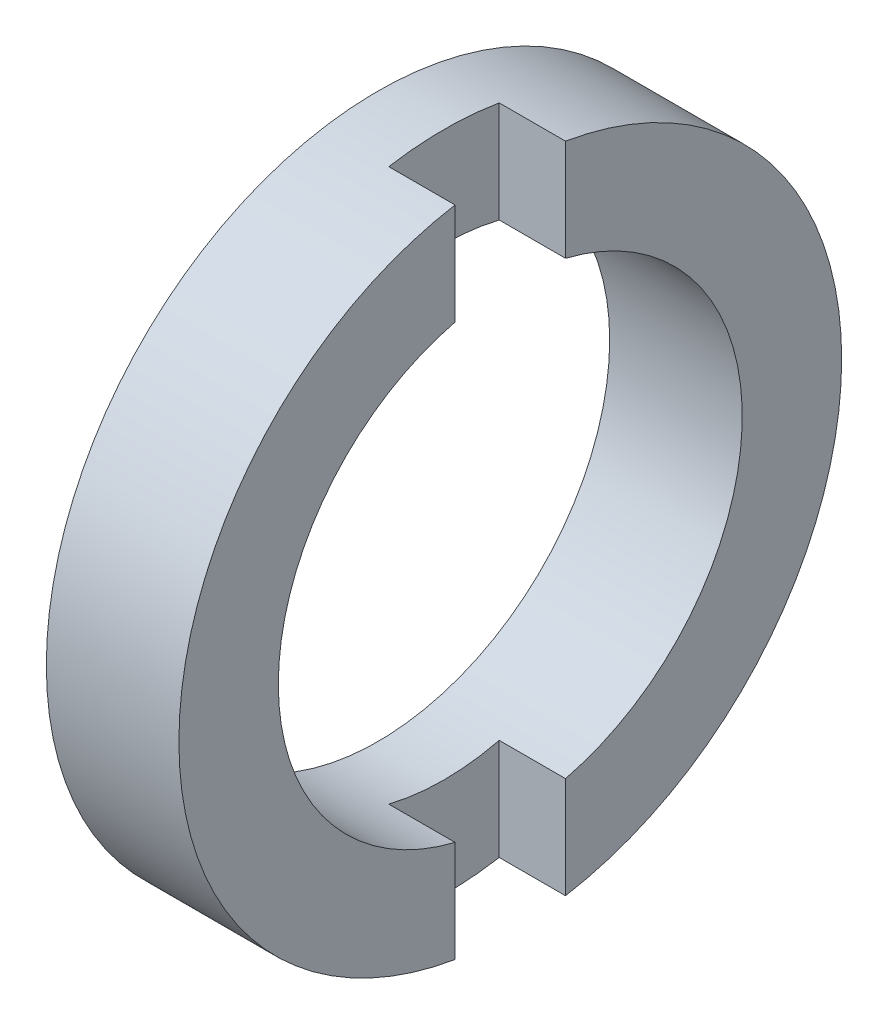
ISO-10303-21;
HEADER;
FILE_DESCRIPTION(('STEP AP214'),'2;1');
FILE_NAME('part.step','',(''),(''),'','','');
FILE_SCHEMA(('AUTOMOTIVE_DESIGN { 1 0 10303 214 1 1 1 1 }'));
ENDSEC;
DATA;
#1=APPLICATION_CONTEXT('core data for automotive mechanical design processes');
#2=APPLICATION_PROTOCOL_DEFINITION('international standard','automotive_design',2000,#1);
#3=PRODUCT_CONTEXT('',#1,'mechanical');
#4=PRODUCT('Part','Part','',(#3));
#5=PRODUCT_RELATED_PRODUCT_CATEGORY('part','',(#4));
#6=PRODUCT_DEFINITION_FORMATION('','',#4);
#7=PRODUCT_DEFINITION_CONTEXT('part definition',#1,'design');
#8=PRODUCT_DEFINITION('design','',#6,#7);
#9=PRODUCT_DEFINITION_SHAPE('','',#8);
#10=(LENGTH_UNIT() NAMED_UNIT(*) SI_UNIT(.MILLI.,.METRE.));
#11=(NAMED_UNIT(*) PLANE_ANGLE_UNIT() SI_UNIT($,.RADIAN.));
#12=(NAMED_UNIT(*) SI_UNIT($,.STERADIAN.) SOLID_ANGLE_UNIT());
#13=UNCERTAINTY_MEASURE_WITH_UNIT(LENGTH_MEASURE(1.E-05),#10,'distance_accuracy_value','');
#14=(GEOMETRIC_REPRESENTATION_CONTEXT(3) GLOBAL_UNCERTAINTY_ASSIGNED_CONTEXT((#13)) GLOBAL_UNIT_ASSIGNED_CONTEXT((#10,
#11,#12)) REPRESENTATION_CONTEXT('',''));
#15=CARTESIAN_POINT('',(0.,0.,0.));
#16=DIRECTION('',(0.,0.,1.));
#17=DIRECTION('',(1.,0.,0.));
#18=AXIS2_PLACEMENT_3D('',#15,#16,#17);
#19=CARTESIAN_POINT('',(6.,-15.,-2.5));
#20=DIRECTION('',(0.,0.,-1.));
#21=DIRECTION('',(-1.,0.,0.));
#22=AXIS2_PLACEMENT_3D('',#19,#20,#21);
#23=PLANE('',#22);
#24=DIRECTION('',(-1.,0.,0.));
#25=VECTOR('',#24,1.);
#26=CARTESIAN_POINT('',(0.,-10.1980390271856,-2.5));
#27=LINE('',#26,#25);
#28=CARTESIAN_POINT('',(6.,-10.1980390271856,-2.5));
#29=VERTEX_POINT('',#28);
#30=CARTESIAN_POINT('',(3.,-10.1980390271856,-2.5));
#31=VERTEX_POINT('',#30);
#32=EDGE_CURVE('E121',#29,#31,#27,.T.);
#33=ORIENTED_EDGE('',*,*,#32,.T.);
#34=DIRECTION('',(0.,1.,0.));
#35=VECTOR('',#34,1.);
#36=CARTESIAN_POINT('',(3.,-15.,-2.5));
#37=LINE('',#36,#35);
#38=CARTESIAN_POINT('',(3.,-14.790199457749,-2.5));
#39=VERTEX_POINT('',#38);
#40=EDGE_CURVE('E90',#31,#39,#37,.F.);
#41=ORIENTED_EDGE('',*,*,#40,.T.);
#42=DIRECTION('',(-1.,0.,0.));
#43=VECTOR('',#42,1.);
#44=CARTESIAN_POINT('',(0.,-14.790199457749,-2.5));
#45=LINE('',#44,#43);
#46=CARTESIAN_POINT('',(6.,-14.790199457749,-2.5));
#47=VERTEX_POINT('',#46);
#48=EDGE_CURVE('E153',#47,#39,#45,.T.);
#49=ORIENTED_EDGE('',*,*,#48,.F.);
#50=DIRECTION('',(0.,1.,0.));
#51=VECTOR('',#50,1.);
#52=CARTESIAN_POINT('',(6.,15.,-2.5));
#53=LINE('',#52,#51);
#54=EDGE_CURVE('E106',#47,#29,#53,.T.);
#55=ORIENTED_EDGE('',*,*,#54,.T.);
#56=EDGE_LOOP('',(#33,#41,#49,#55));
#57=FACE_BOUND('',#56,.T.);
#58=ADVANCED_FACE('F17',(#57),#23,.F.);
#59=CARTESIAN_POINT('',(3.,-15.,-2.5));
#60=DIRECTION('',(-1.,0.,0.));
#61=DIRECTION('',(0.,0.,1.));
#62=AXIS2_PLACEMENT_3D('',#59,#60,#61);
#63=PLANE('',#62);
#64=CARTESIAN_POINT('',(3.,0.,0.));
#65=DIRECTION('',(-1.,0.,0.));
#66=DIRECTION('',(0.,0.,1.));
#67=AXIS2_PLACEMENT_3D('',#64,#65,#66);
#68=CIRCLE('',#67,10.5);
#69=CARTESIAN_POINT('',(3.,-10.1980390271856,2.5));
#70=VERTEX_POINT('',#69);
#71=EDGE_CURVE('E20',#31,#70,#68,.T.);
#72=ORIENTED_EDGE('',*,*,#71,.T.);
#73=DIRECTION('',(0.,1.,0.));
#74=VECTOR('',#73,1.);
#75=CARTESIAN_POINT('',(3.,-15.,2.5));
#76=LINE('',#75,#74);
#77=CARTESIAN_POINT('',(3.,-14.790199457749,2.49999999999999));
#78=VERTEX_POINT('',#77);
#79=EDGE_CURVE('E98',#70,#78,#76,.F.);
#80=ORIENTED_EDGE('',*,*,#79,.T.);
#81=CARTESIAN_POINT('',(3.,0.,0.));
#82=DIRECTION('',(-1.,0.,0.));
#83=DIRECTION('',(0.,0.,1.));
#84=AXIS2_PLACEMENT_3D('',#81,#82,#83);
#85=CIRCLE('',#84,15.);
#86=EDGE_CURVE('E150',#39,#78,#85,.T.);
#87=ORIENTED_EDGE('',*,*,#86,.F.);
#88=ORIENTED_EDGE('',*,*,#40,.F.);
#89=EDGE_LOOP('',(#72,#80,#87,#88));
#90=FACE_BOUND('',#89,.T.);
#91=ADVANCED_FACE('F119',(#90),#63,.F.);
#92=CARTESIAN_POINT('',(6.,-15.,2.5));
#93=DIRECTION('',(0.,0.,1.));
#94=DIRECTION('',(1.,0.,0.));
#95=AXIS2_PLACEMENT_3D('',#92,#93,#94);
#96=PLANE('',#95);
#97=DIRECTION('',(-1.,0.,0.));
#98=VECTOR('',#97,1.);
#99=CARTESIAN_POINT('',(0.,-10.1980390271856,2.5));
#100=LINE('',#99,#98);
#101=CARTESIAN_POINT('',(6.,-10.1980390271856,2.5));
#102=VERTEX_POINT('',#101);
#103=EDGE_CURVE('E102',#70,#102,#100,.F.);
#104=ORIENTED_EDGE('',*,*,#103,.T.);
#105=DIRECTION('',(0.,1.,0.));
#106=VECTOR('',#105,1.);
#107=CARTESIAN_POINT('',(6.,15.,2.5));
#108=LINE('',#107,#106);
#109=CARTESIAN_POINT('',(6.,-14.790199457749,2.5));
#110=VERTEX_POINT('',#109);
#111=EDGE_CURVE('E184',#102,#110,#108,.F.);
#112=ORIENTED_EDGE('',*,*,#111,.T.);
#113=DIRECTION('',(-1.,0.,0.));
#114=VECTOR('',#113,1.);
#115=CARTESIAN_POINT('',(0.,-14.790199457749,2.49999999999999));
#116=LINE('',#115,#114);
#117=EDGE_CURVE('E104',#78,#110,#116,.F.);
#118=ORIENTED_EDGE('',*,*,#117,.F.);
#119=ORIENTED_EDGE('',*,*,#79,.F.);
#120=EDGE_LOOP('',(#104,#112,#118,#119));
#121=FACE_BOUND('',#120,.T.);
#122=ADVANCED_FACE('F100',(#121),#96,.F.);
#123=CARTESIAN_POINT('',(6.,15.,0.));
#124=DIRECTION('',(-1.,0.,0.));
#125=DIRECTION('',(0.,0.,1.));
#126=AXIS2_PLACEMENT_3D('',#123,#124,#125);
#127=PLANE('',#126);
#128=DIRECTION('',(0.,1.,0.));
#129=VECTOR('',#128,1.);
#130=CARTESIAN_POINT('',(6.,-15.,-2.5));
#131=LINE('',#130,#129);
#132=CARTESIAN_POINT('',(6.,14.790199457749,-2.5));
#133=VERTEX_POINT('',#132);
#134=CARTESIAN_POINT('',(6.,10.1980390271856,-2.5));
#135=VERTEX_POINT('',#134);
#136=EDGE_CURVE('E132',#133,#135,#131,.F.);
#137=ORIENTED_EDGE('',*,*,#136,.T.);
#138=CARTESIAN_POINT('',(6.,0.,0.));
#139=DIRECTION('',(-1.,0.,0.));
#140=DIRECTION('',(0.,0.,1.));
#141=AXIS2_PLACEMENT_3D('',#138,#139,#140);
#142=CIRCLE('',#141,10.5);
#143=EDGE_CURVE('E154',#135,#29,#142,.T.);
#144=ORIENTED_EDGE('',*,*,#143,.T.);
#145=ORIENTED_EDGE('',*,*,#54,.F.);
#146=CARTESIAN_POINT('',(6.,0.,0.));
#147=DIRECTION('',(-1.,0.,0.));
#148=DIRECTION('',(0.,0.,1.));
#149=AXIS2_PLACEMENT_3D('',#146,#147,#148);
#150=CIRCLE('',#149,15.);
#151=EDGE_CURVE('E147',#133,#47,#150,.T.);
#152=ORIENTED_EDGE('',*,*,#151,.F.);
#153=EDGE_LOOP('',(#137,#144,#145,#152));
#154=FACE_BOUND('',#153,.T.);
#155=ADVANCED_FACE('F199',(#154),#127,.F.);
#156=CARTESIAN_POINT('',(6.,15.,0.));
#157=DIRECTION('',(-1.,0.,0.));
#158=DIRECTION('',(0.,0.,1.));
#159=AXIS2_PLACEMENT_3D('',#156,#157,#158);
#160=PLANE('',#159);
#161=ORIENTED_EDGE('',*,*,#111,.F.);
#162=CARTESIAN_POINT('',(6.,0.,0.));
#163=DIRECTION('',(-1.,0.,0.));
#164=DIRECTION('',(0.,0.,1.));
#165=AXIS2_PLACEMENT_3D('',#162,#163,#164);
#166=CIRCLE('',#165,10.5);
#167=CARTESIAN_POINT('',(6.,10.1980390271856,2.5));
#168=VERTEX_POINT('',#167);
#169=EDGE_CURVE('E115',#102,#168,#166,.T.);
#170=ORIENTED_EDGE('',*,*,#169,.T.);
#171=DIRECTION('',(0.,1.,0.));
#172=VECTOR('',#171,1.);
#173=CARTESIAN_POINT('',(6.,-15.,2.5));
#174=LINE('',#173,#172);
#175=CARTESIAN_POINT('',(6.,14.790199457749,2.5));
#176=VERTEX_POINT('',#175);
#177=EDGE_CURVE('E173',#168,#176,#174,.T.);
#178=ORIENTED_EDGE('',*,*,#177,.T.);
#179=CARTESIAN_POINT('',(6.,0.,0.));
#180=DIRECTION('',(-1.,0.,0.));
#181=DIRECTION('',(0.,0.,1.));
#182=AXIS2_PLACEMENT_3D('',#179,#180,#181);
#183=CIRCLE('',#182,15.);
#184=EDGE_CURVE('E144',#110,#176,#183,.T.);
#185=ORIENTED_EDGE('',*,*,#184,.F.);
#186=EDGE_LOOP('',(#161,#170,#178,#185));
#187=FACE_BOUND('',#186,.T.);
#188=ADVANCED_FACE('F201',(#187),#160,.F.);
#189=CARTESIAN_POINT('',(6.,-15.,2.5));
#190=DIRECTION('',(0.,0.,1.));
#191=DIRECTION('',(1.,0.,0.));
#192=AXIS2_PLACEMENT_3D('',#189,#190,#191);
#193=PLANE('',#192);
#194=DIRECTION('',(-1.,0.,0.));
#195=VECTOR('',#194,1.);
#196=CARTESIAN_POINT('',(0.,10.1980390271856,2.5));
#197=LINE('',#196,#195);
#198=CARTESIAN_POINT('',(3.,10.1980390271856,2.5));
#199=VERTEX_POINT('',#198);
#200=EDGE_CURVE('E135',#168,#199,#197,.T.);
#201=ORIENTED_EDGE('',*,*,#200,.T.);
#202=DIRECTION('',(0.,1.,0.));
#203=VECTOR('',#202,1.);
#204=CARTESIAN_POINT('',(3.,-15.,2.5));
#205=LINE('',#204,#203);
#206=CARTESIAN_POINT('',(3.,14.790199457749,2.5));
#207=VERTEX_POINT('',#206);
#208=EDGE_CURVE('E172',#199,#207,#205,.T.);
#209=ORIENTED_EDGE('',*,*,#208,.T.);
#210=DIRECTION('',(-1.,0.,0.));
#211=VECTOR('',#210,1.);
#212=CARTESIAN_POINT('',(0.,14.790199457749,2.5));
#213=LINE('',#212,#211);
#214=EDGE_CURVE('E143',#176,#207,#213,.T.);
#215=ORIENTED_EDGE('',*,*,#214,.F.);
#216=ORIENTED_EDGE('',*,*,#177,.F.);
#217=EDGE_LOOP('',(#201,#209,#215,#216));
#218=FACE_BOUND('',#217,.T.);
#219=ADVANCED_FACE('F170',(#218),#193,.F.);
#220=CARTESIAN_POINT('',(3.,-15.,-2.5));
#221=DIRECTION('',(-1.,0.,0.));
#222=DIRECTION('',(0.,0.,1.));
#223=AXIS2_PLACEMENT_3D('',#220,#221,#222);
#224=PLANE('',#223);
#225=CARTESIAN_POINT('',(3.,0.,0.));
#226=DIRECTION('',(-1.,0.,0.));
#227=DIRECTION('',(0.,0.,1.));
#228=AXIS2_PLACEMENT_3D('',#225,#226,#227);
#229=CIRCLE('',#228,10.5);
#230=CARTESIAN_POINT('',(3.,10.1980390271856,-2.5));
#231=VERTEX_POINT('',#230);
#232=EDGE_CURVE('E158',#199,#231,#229,.T.);
#233=ORIENTED_EDGE('',*,*,#232,.T.);
#234=DIRECTION('',(0.,1.,0.));
#235=VECTOR('',#234,1.);
#236=CARTESIAN_POINT('',(3.,-15.,-2.5));
#237=LINE('',#236,#235);
#238=CARTESIAN_POINT('',(3.,14.790199457749,-2.5));
#239=VERTEX_POINT('',#238);
#240=EDGE_CURVE('E126',#231,#239,#237,.T.);
#241=ORIENTED_EDGE('',*,*,#240,.T.);
#242=CARTESIAN_POINT('',(3.,0.,0.));
#243=DIRECTION('',(-1.,0.,0.));
#244=DIRECTION('',(0.,0.,1.));
#245=AXIS2_PLACEMENT_3D('',#242,#243,#244);
#246=CIRCLE('',#245,15.);
#247=EDGE_CURVE('E36',#207,#239,#246,.T.);
#248=ORIENTED_EDGE('',*,*,#247,.F.);
#249=ORIENTED_EDGE('',*,*,#208,.F.);
#250=EDGE_LOOP('',(#233,#241,#248,#249));
#251=FACE_BOUND('',#250,.T.);
#252=ADVANCED_FACE('F179',(#251),#224,.F.);
#253=CARTESIAN_POINT('',(6.,-15.,-2.5));
#254=DIRECTION('',(0.,0.,-1.));
#255=DIRECTION('',(-1.,0.,0.));
#256=AXIS2_PLACEMENT_3D('',#253,#254,#255);
#257=PLANE('',#256);
#258=DIRECTION('',(-1.,0.,0.));
#259=VECTOR('',#258,1.);
#260=CARTESIAN_POINT('',(0.,10.1980390271856,-2.5));
#261=LINE('',#260,#259);
#262=EDGE_CURVE('E157',#231,#135,#261,.F.);
#263=ORIENTED_EDGE('',*,*,#262,.T.);
#264=ORIENTED_EDGE('',*,*,#136,.F.);
#265=DIRECTION('',(-1.,0.,0.));
#266=VECTOR('',#265,1.);
#267=CARTESIAN_POINT('',(0.,14.790199457749,-2.5));
#268=LINE('',#267,#266);
#269=EDGE_CURVE('E141',#239,#133,#268,.F.);
#270=ORIENTED_EDGE('',*,*,#269,.F.);
#271=ORIENTED_EDGE('',*,*,#240,.F.);
#272=EDGE_LOOP('',(#263,#264,#270,#271));
#273=FACE_BOUND('',#272,.T.);
#274=ADVANCED_FACE('F194',(#273),#257,.F.);
#275=CARTESIAN_POINT('',(0.,0.,0.));
#276=DIRECTION('',(-1.,0.,0.));
#277=DIRECTION('',(0.,0.,1.));
#278=AXIS2_PLACEMENT_3D('',#275,#276,#277);
#279=CYLINDRICAL_SURFACE('',#278,10.5);
#280=ORIENTED_EDGE('',*,*,#169,.F.);
#281=ORIENTED_EDGE('',*,*,#103,.F.);
#282=ORIENTED_EDGE('',*,*,#71,.F.);
#283=ORIENTED_EDGE('',*,*,#32,.F.);
#284=ORIENTED_EDGE('',*,*,#143,.F.);
#285=ORIENTED_EDGE('',*,*,#262,.F.);
#286=ORIENTED_EDGE('',*,*,#232,.F.);
#287=ORIENTED_EDGE('',*,*,#200,.F.);
#288=EDGE_LOOP('',(#280,#281,#282,#283,#284,#285,#286,#287));
#289=FACE_BOUND('',#288,.T.);
#290=CARTESIAN_POINT('',(0.,0.,0.));
#291=DIRECTION('',(-1.,0.,0.));
#292=DIRECTION('',(0.,0.,1.));
#293=AXIS2_PLACEMENT_3D('',#290,#291,#292);
#294=CIRCLE('',#293,10.5);
#295=CARTESIAN_POINT('',(0.,0.,10.5));
#296=VERTEX_POINT('',#295);
#297=EDGE_CURVE('E27',#296,#296,#294,.T.);
#298=ORIENTED_EDGE('',*,*,#297,.T.);
#299=EDGE_LOOP('',(#298));
#300=FACE_BOUND('',#299,.T.);
#301=ADVANCED_FACE('F109',(#289,#300),#279,.F.);
#302=CARTESIAN_POINT('',(0.,0.,0.));
#303=DIRECTION('',(-1.,0.,0.));
#304=DIRECTION('',(0.,0.,1.));
#305=AXIS2_PLACEMENT_3D('',#302,#303,#304);
#306=CYLINDRICAL_SURFACE('',#305,15.);
#307=CARTESIAN_POINT('',(0.,0.,0.));
#308=DIRECTION('',(-1.,0.,0.));
#309=DIRECTION('',(0.,0.,1.));
#310=AXIS2_PLACEMENT_3D('',#307,#308,#309);
#311=CIRCLE('',#310,15.);
#312=CARTESIAN_POINT('',(0.,0.,15.));
#313=VERTEX_POINT('',#312);
#314=EDGE_CURVE('E11',#313,#313,#311,.F.);
#315=ORIENTED_EDGE('',*,*,#314,.T.);
#316=EDGE_LOOP('',(#315));
#317=FACE_BOUND('',#316,.T.);
#318=ORIENTED_EDGE('',*,*,#247,.T.);
#319=ORIENTED_EDGE('',*,*,#269,.T.);
#320=ORIENTED_EDGE('',*,*,#151,.T.);
#321=ORIENTED_EDGE('',*,*,#48,.T.);
#322=ORIENTED_EDGE('',*,*,#86,.T.);
#323=ORIENTED_EDGE('',*,*,#117,.T.);
#324=ORIENTED_EDGE('',*,*,#184,.T.);
#325=ORIENTED_EDGE('',*,*,#214,.T.);
#326=EDGE_LOOP('',(#318,#319,#320,#321,#322,#323,#324,#325));
#327=FACE_BOUND('',#326,.T.);
#328=ADVANCED_FACE('F196',(#317,#327),#306,.T.);
#329=CARTESIAN_POINT('',(0.,10.5,0.));
#330=DIRECTION('',(1.,0.,0.));
#331=DIRECTION('',(0.,0.,-1.));
#332=AXIS2_PLACEMENT_3D('',#329,#330,#331);
#333=PLANE('',#332);
#334=ORIENTED_EDGE('',*,*,#314,.F.);
#335=EDGE_LOOP('',(#334));
#336=FACE_BOUND('',#335,.T.);
#337=ORIENTED_EDGE('',*,*,#297,.F.);
#338=EDGE_LOOP('',(#337));
#339=FACE_BOUND('',#338,.T.);
#340=ADVANCED_FACE('F211',(#336,#339),#333,.F.);
#341=CLOSED_SHELL('',(#58,#91,#122,#155,#188,#219,#252,#274,#301,#328,#340));
#342=MANIFOLD_SOLID_BREP('B1',#341);
#343=ADVANCED_BREP_SHAPE_REPRESENTATION('',(#18,#342),#14);
#344=SHAPE_DEFINITION_REPRESENTATION(#9,#343);
ENDSEC;
END-ISO-10303-21;
